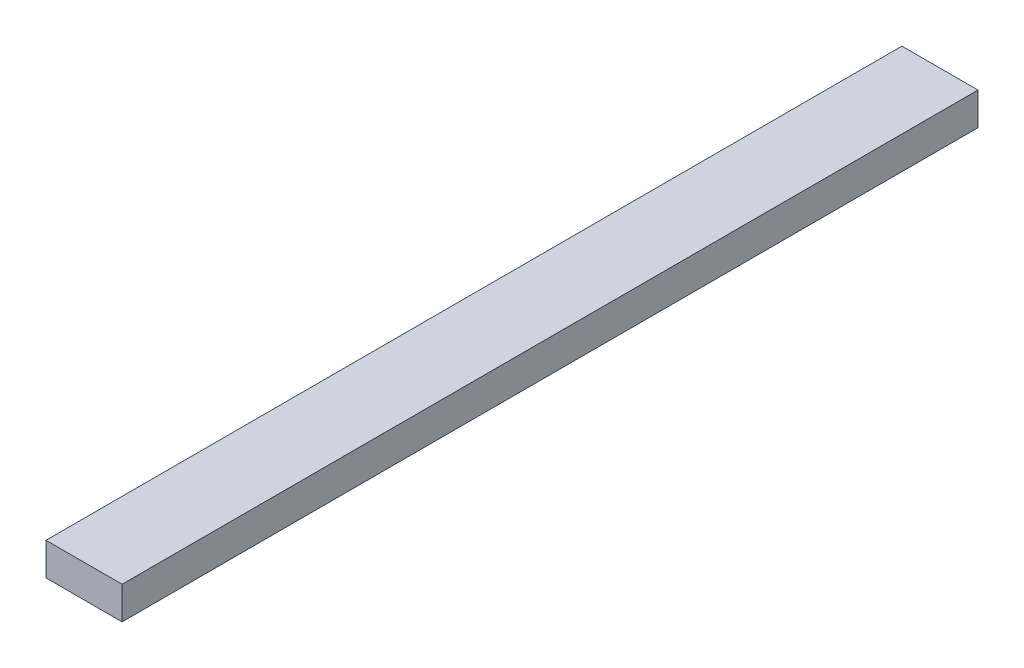
ISO-10303-21;
HEADER;
FILE_DESCRIPTION(('STEP AP214'),'2;1');
FILE_NAME('part.step','',(''),(''),'','','');
FILE_SCHEMA(('AUTOMOTIVE_DESIGN { 1 0 10303 214 1 1 1 1 }'));
ENDSEC;
DATA;
#1=APPLICATION_CONTEXT('core data for automotive mechanical design processes');
#2=APPLICATION_PROTOCOL_DEFINITION('international standard','automotive_design',2000,#1);
#3=PRODUCT_CONTEXT('',#1,'mechanical');
#4=PRODUCT('Part','Part','',(#3));
#5=PRODUCT_RELATED_PRODUCT_CATEGORY('part','',(#4));
#6=PRODUCT_DEFINITION_FORMATION('','',#4);
#7=PRODUCT_DEFINITION_CONTEXT('part definition',#1,'design');
#8=PRODUCT_DEFINITION('design','',#6,#7);
#9=PRODUCT_DEFINITION_SHAPE('','',#8);
#10=(LENGTH_UNIT() NAMED_UNIT(*) SI_UNIT(.MILLI.,.METRE.));
#11=(NAMED_UNIT(*) PLANE_ANGLE_UNIT() SI_UNIT($,.RADIAN.));
#12=(NAMED_UNIT(*) SI_UNIT($,.STERADIAN.) SOLID_ANGLE_UNIT());
#13=UNCERTAINTY_MEASURE_WITH_UNIT(LENGTH_MEASURE(1.E-05),#10,'distance_accuracy_value','');
#14=(GEOMETRIC_REPRESENTATION_CONTEXT(3) GLOBAL_UNCERTAINTY_ASSIGNED_CONTEXT((#13)) GLOBAL_UNIT_ASSIGNED_CONTEXT((#10,
#11,#12)) REPRESENTATION_CONTEXT('',''));
#15=CARTESIAN_POINT('',(0.,0.,0.));
#16=DIRECTION('',(0.,0.,1.));
#17=DIRECTION('',(1.,0.,0.));
#18=AXIS2_PLACEMENT_3D('',#15,#16,#17);
#19=CARTESIAN_POINT('',(44.45,-19.05,1000.));
#20=DIRECTION('',(-1.,0.,0.));
#21=DIRECTION('',(0.,0.,1.));
#22=AXIS2_PLACEMENT_3D('',#19,#20,#21);
#23=PLANE('',#22);
#24=DIRECTION('',(0.,1.,0.));
#25=VECTOR('',#24,1.);
#26=CARTESIAN_POINT('',(44.45,-19.05,0.));
#27=LINE('',#26,#25);
#28=CARTESIAN_POINT('',(44.45,-19.05,0.));
#29=VERTEX_POINT('',#28);
#30=CARTESIAN_POINT('',(44.45,19.05,0.));
#31=VERTEX_POINT('',#30);
#32=EDGE_CURVE('E96',#29,#31,#27,.T.);
#33=ORIENTED_EDGE('',*,*,#32,.T.);
#34=DIRECTION('',(0.,0.,-1.));
#35=VECTOR('',#34,1.);
#36=CARTESIAN_POINT('',(44.45,19.05,1000.));
#37=LINE('',#36,#35);
#38=CARTESIAN_POINT('',(44.45,19.05,1000.));
#39=VERTEX_POINT('',#38);
#40=EDGE_CURVE('E11',#39,#31,#37,.T.);
#41=ORIENTED_EDGE('',*,*,#40,.F.);
#42=DIRECTION('',(0.,1.,0.));
#43=VECTOR('',#42,1.);
#44=CARTESIAN_POINT('',(44.45,-19.05,1000.));
#45=LINE('',#44,#43);
#46=CARTESIAN_POINT('',(44.45,-19.05,1000.));
#47=VERTEX_POINT('',#46);
#48=EDGE_CURVE('E84',#47,#39,#45,.T.);
#49=ORIENTED_EDGE('',*,*,#48,.F.);
#50=DIRECTION('',(0.,0.,-1.));
#51=VECTOR('',#50,1.);
#52=CARTESIAN_POINT('',(44.45,-19.05,1000.));
#53=LINE('',#52,#51);
#54=EDGE_CURVE('E92',#47,#29,#53,.T.);
#55=ORIENTED_EDGE('',*,*,#54,.T.);
#56=EDGE_LOOP('',(#33,#41,#49,#55));
#57=FACE_BOUND('',#56,.T.);
#58=ADVANCED_FACE('F33',(#57),#23,.F.);
#59=CARTESIAN_POINT('',(-44.45,19.05,1000.));
#60=DIRECTION('',(0.,-1.,0.));
#61=DIRECTION('',(0.,0.,-1.));
#62=AXIS2_PLACEMENT_3D('',#59,#60,#61);
#63=PLANE('',#62);
#64=DIRECTION('',(-1.,0.,0.));
#65=VECTOR('',#64,1.);
#66=CARTESIAN_POINT('',(-44.45,19.05,0.));
#67=LINE('',#66,#65);
#68=CARTESIAN_POINT('',(-44.45,19.05,0.));
#69=VERTEX_POINT('',#68);
#70=EDGE_CURVE('E88',#31,#69,#67,.T.);
#71=ORIENTED_EDGE('',*,*,#70,.T.);
#72=DIRECTION('',(0.,0.,-1.));
#73=VECTOR('',#72,1.);
#74=CARTESIAN_POINT('',(-44.45,19.05,1000.));
#75=LINE('',#74,#73);
#76=CARTESIAN_POINT('',(-44.45,19.05,1000.));
#77=VERTEX_POINT('',#76);
#78=EDGE_CURVE('E41',#77,#69,#75,.T.);
#79=ORIENTED_EDGE('',*,*,#78,.F.);
#80=DIRECTION('',(-1.,0.,0.));
#81=VECTOR('',#80,1.);
#82=CARTESIAN_POINT('',(-44.45,19.05,1000.));
#83=LINE('',#82,#81);
#84=EDGE_CURVE('E79',#39,#77,#83,.T.);
#85=ORIENTED_EDGE('',*,*,#84,.F.);
#86=ORIENTED_EDGE('',*,*,#40,.T.);
#87=EDGE_LOOP('',(#71,#79,#85,#86));
#88=FACE_BOUND('',#87,.T.);
#89=ADVANCED_FACE('F87',(#88),#63,.F.);
#90=CARTESIAN_POINT('',(-44.45,-19.05,1000.));
#91=DIRECTION('',(1.,0.,0.));
#92=DIRECTION('',(0.,0.,-1.));
#93=AXIS2_PLACEMENT_3D('',#90,#91,#92);
#94=PLANE('',#93);
#95=DIRECTION('',(0.,-1.,0.));
#96=VECTOR('',#95,1.);
#97=CARTESIAN_POINT('',(-44.45,-19.05,0.));
#98=LINE('',#97,#96);
#99=CARTESIAN_POINT('',(-44.45,-19.05,0.));
#100=VERTEX_POINT('',#99);
#101=EDGE_CURVE('E66',#69,#100,#98,.T.);
#102=ORIENTED_EDGE('',*,*,#101,.T.);
#103=DIRECTION('',(0.,0.,-1.));
#104=VECTOR('',#103,1.);
#105=CARTESIAN_POINT('',(-44.45,-19.05,1000.));
#106=LINE('',#105,#104);
#107=CARTESIAN_POINT('',(-44.45,-19.05,1000.));
#108=VERTEX_POINT('',#107);
#109=EDGE_CURVE('E89',#108,#100,#106,.T.);
#110=ORIENTED_EDGE('',*,*,#109,.F.);
#111=DIRECTION('',(0.,-1.,0.));
#112=VECTOR('',#111,1.);
#113=CARTESIAN_POINT('',(-44.45,-19.05,1000.));
#114=LINE('',#113,#112);
#115=EDGE_CURVE('E82',#77,#108,#114,.T.);
#116=ORIENTED_EDGE('',*,*,#115,.F.);
#117=ORIENTED_EDGE('',*,*,#78,.T.);
#118=EDGE_LOOP('',(#102,#110,#116,#117));
#119=FACE_BOUND('',#118,.T.);
#120=ADVANCED_FACE('F90',(#119),#94,.F.);
#121=CARTESIAN_POINT('',(-44.45,-19.05,1000.));
#122=DIRECTION('',(0.,1.,0.));
#123=DIRECTION('',(0.,0.,1.));
#124=AXIS2_PLACEMENT_3D('',#121,#122,#123);
#125=PLANE('',#124);
#126=DIRECTION('',(1.,0.,0.));
#127=VECTOR('',#126,1.);
#128=CARTESIAN_POINT('',(-44.45,-19.05,0.));
#129=LINE('',#128,#127);
#130=EDGE_CURVE('E72',#100,#29,#129,.T.);
#131=ORIENTED_EDGE('',*,*,#130,.T.);
#132=ORIENTED_EDGE('',*,*,#54,.F.);
#133=DIRECTION('',(1.,0.,0.));
#134=VECTOR('',#133,1.);
#135=CARTESIAN_POINT('',(-44.45,-19.05,1000.));
#136=LINE('',#135,#134);
#137=EDGE_CURVE('E49',#108,#47,#136,.T.);
#138=ORIENTED_EDGE('',*,*,#137,.F.);
#139=ORIENTED_EDGE('',*,*,#109,.T.);
#140=EDGE_LOOP('',(#131,#132,#138,#139));
#141=FACE_BOUND('',#140,.T.);
#142=ADVANCED_FACE('F103',(#141),#125,.F.);
#143=CARTESIAN_POINT('',(0.,0.,1000.));
#144=DIRECTION('',(0.,0.,-1.));
#145=DIRECTION('',(-1.,0.,0.));
#146=AXIS2_PLACEMENT_3D('',#143,#144,#145);
#147=PLANE('',#146);
#148=ORIENTED_EDGE('',*,*,#48,.T.);
#149=ORIENTED_EDGE('',*,*,#84,.T.);
#150=ORIENTED_EDGE('',*,*,#115,.T.);
#151=ORIENTED_EDGE('',*,*,#137,.T.);
#152=EDGE_LOOP('',(#148,#149,#150,#151));
#153=FACE_BOUND('',#152,.T.);
#154=ADVANCED_FACE('F80',(#153),#147,.F.);
#155=CARTESIAN_POINT('',(0.,0.,0.));
#156=DIRECTION('',(0.,0.,-1.));
#157=DIRECTION('',(-1.,0.,0.));
#158=AXIS2_PLACEMENT_3D('',#155,#156,#157);
#159=PLANE('',#158);
#160=ORIENTED_EDGE('',*,*,#32,.F.);
#161=ORIENTED_EDGE('',*,*,#130,.F.);
#162=ORIENTED_EDGE('',*,*,#101,.F.);
#163=ORIENTED_EDGE('',*,*,#70,.F.);
#164=EDGE_LOOP('',(#160,#161,#162,#163));
#165=FACE_BOUND('',#164,.T.);
#166=ADVANCED_FACE('F106',(#165),#159,.T.);
#167=CLOSED_SHELL('',(#58,#89,#120,#142,#154,#166));
#168=MANIFOLD_SOLID_BREP('B2',#167);
#169=ADVANCED_BREP_SHAPE_REPRESENTATION('',(#18,#168),#14);
#170=SHAPE_DEFINITION_REPRESENTATION(#9,#169);
ENDSEC;
END-ISO-10303-21;
